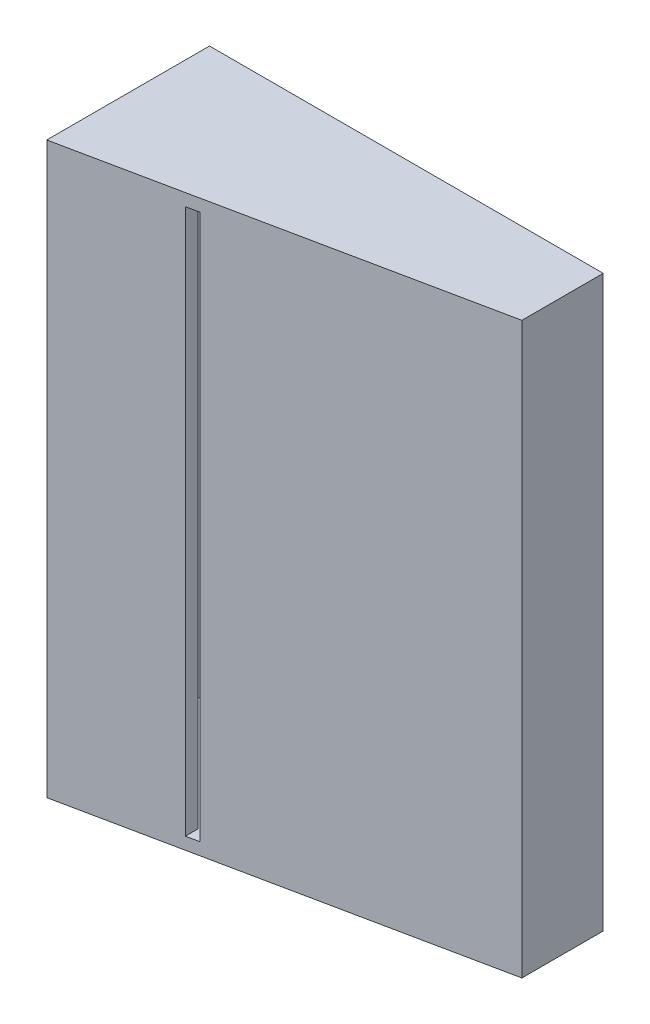
ISO-10303-21;
HEADER;
FILE_DESCRIPTION(('STEP AP214'),'2;1');
FILE_NAME('part.step','',(''),(''),'','','');
FILE_SCHEMA(('AUTOMOTIVE_DESIGN { 1 0 10303 214 1 1 1 1 }'));
ENDSEC;
DATA;
#1=APPLICATION_CONTEXT('core data for automotive mechanical design processes');
#2=APPLICATION_PROTOCOL_DEFINITION('international standard','automotive_design',2000,#1);
#3=PRODUCT_CONTEXT('',#1,'mechanical');
#4=PRODUCT('Part','Part','',(#3));
#5=PRODUCT_RELATED_PRODUCT_CATEGORY('part','',(#4));
#6=PRODUCT_DEFINITION_FORMATION('','',#4);
#7=PRODUCT_DEFINITION_CONTEXT('part definition',#1,'design');
#8=PRODUCT_DEFINITION('design','',#6,#7);
#9=PRODUCT_DEFINITION_SHAPE('','',#8);
#10=(LENGTH_UNIT() NAMED_UNIT(*) SI_UNIT(.MILLI.,.METRE.));
#11=(NAMED_UNIT(*) PLANE_ANGLE_UNIT() SI_UNIT($,.RADIAN.));
#12=(NAMED_UNIT(*) SI_UNIT($,.STERADIAN.) SOLID_ANGLE_UNIT());
#13=UNCERTAINTY_MEASURE_WITH_UNIT(LENGTH_MEASURE(1.E-05),#10,'distance_accuracy_value','');
#14=(GEOMETRIC_REPRESENTATION_CONTEXT(3) GLOBAL_UNCERTAINTY_ASSIGNED_CONTEXT((#13)) GLOBAL_UNIT_ASSIGNED_CONTEXT((#10,
#11,#12)) REPRESENTATION_CONTEXT('',''));
#15=CARTESIAN_POINT('',(0.,0.,0.));
#16=DIRECTION('',(0.,0.,1.));
#17=DIRECTION('',(1.,0.,0.));
#18=AXIS2_PLACEMENT_3D('',#15,#16,#17);
#19=CARTESIAN_POINT('',(0.,75.1134184450831,8.77829955942791));
#20=DIRECTION('',(0.202388113855779,0.,0.979305392290832));
#21=DIRECTION('',(0.979305392290832,0.,-0.202388113855779));
#22=AXIS2_PLACEMENT_3D('',#19,#20,#21);
#23=PLANE('',#22);
#24=DIRECTION('',(-0.979305392290832,0.,0.202388113855779));
#25=VECTOR('',#24,1.);
#26=CARTESIAN_POINT('',(0.,-8.25000000000003,8.77829955942791));
#27=LINE('',#26,#25);
#28=CARTESIAN_POINT('',(0.,-8.25000000000003,8.77829955942791));
#29=VERTEX_POINT('',#28);
#30=CARTESIAN_POINT('',(-31.27,-8.25000000000003,15.2407129905088));
#31=VERTEX_POINT('',#30);
#32=EDGE_CURVE('E264',#29,#31,#27,.T.);
#33=ORIENTED_EDGE('',*,*,#32,.T.);
#34=DIRECTION('',(0.,1.,0.));
#35=VECTOR('',#34,1.);
#36=CARTESIAN_POINT('',(-31.27,75.1134184450831,15.2407129905088));
#37=LINE('',#36,#35);
#38=CARTESIAN_POINT('',(-31.27,58.7499999999998,15.2407129905088));
#39=VERTEX_POINT('',#38);
#40=EDGE_CURVE('E242',#31,#39,#37,.T.);
#41=ORIENTED_EDGE('',*,*,#40,.T.);
#42=DIRECTION('',(-0.979305392290832,0.,0.202388113855779));
#43=VECTOR('',#42,1.);
#44=CARTESIAN_POINT('',(0.,58.7499999999998,8.77829955942791));
#45=LINE('',#44,#43);
#46=CARTESIAN_POINT('',(0.,58.7499999999998,8.77829955942791));
#47=VERTEX_POINT('',#46);
#48=EDGE_CURVE('E253',#47,#39,#45,.T.);
#49=ORIENTED_EDGE('',*,*,#48,.F.);
#50=DIRECTION('',(0.,-1.,0.));
#51=VECTOR('',#50,1.);
#52=CARTESIAN_POINT('',(0.,75.1134184450831,8.77829955942791));
#53=LINE('',#52,#51);
#54=EDGE_CURVE('E263',#47,#29,#53,.T.);
#55=ORIENTED_EDGE('',*,*,#54,.T.);
#56=EDGE_LOOP('',(#33,#41,#49,#55));
#57=FACE_BOUND('',#56,.T.);
#58=ADVANCED_FACE('F33',(#57),#23,.F.);
#59=CARTESIAN_POINT('',(-46.8874953737985,75.1134184450831,1.5));
#60=DIRECTION('',(0.,0.,-1.));
#61=DIRECTION('',(-1.,0.,0.));
#62=AXIS2_PLACEMENT_3D('',#59,#60,#61);
#63=PLANE('',#62);
#64=DIRECTION('',(1.,0.,0.));
#65=VECTOR('',#64,1.);
#66=CARTESIAN_POINT('',(-46.8874953737985,58.7499999999998,1.5));
#67=LINE('',#66,#65);
#68=CARTESIAN_POINT('',(-31.27,58.7499999999998,1.5));
#69=VERTEX_POINT('',#68);
#70=CARTESIAN_POINT('',(0.,58.7499999999998,1.5));
#71=VERTEX_POINT('',#70);
#72=EDGE_CURVE('E245',#69,#71,#67,.T.);
#73=ORIENTED_EDGE('',*,*,#72,.F.);
#74=DIRECTION('',(0.,-1.,0.));
#75=VECTOR('',#74,1.);
#76=CARTESIAN_POINT('',(-31.27,75.1134184450831,1.5));
#77=LINE('',#76,#75);
#78=CARTESIAN_POINT('',(-31.27,-8.25000000000002,1.5));
#79=VERTEX_POINT('',#78);
#80=EDGE_CURVE('E239',#69,#79,#77,.T.);
#81=ORIENTED_EDGE('',*,*,#80,.T.);
#82=DIRECTION('',(1.,0.,0.));
#83=VECTOR('',#82,1.);
#84=CARTESIAN_POINT('',(-46.8874953737985,-8.25000000000003,1.5));
#85=LINE('',#84,#83);
#86=CARTESIAN_POINT('',(0.,-8.25000000000003,1.5));
#87=VERTEX_POINT('',#86);
#88=EDGE_CURVE('E259',#79,#87,#85,.T.);
#89=ORIENTED_EDGE('',*,*,#88,.T.);
#90=DIRECTION('',(0.,-1.,0.));
#91=VECTOR('',#90,1.);
#92=CARTESIAN_POINT('',(0.,75.1134184450831,1.5));
#93=LINE('',#92,#91);
#94=EDGE_CURVE('E275',#71,#87,#93,.T.);
#95=ORIENTED_EDGE('',*,*,#94,.F.);
#96=EDGE_LOOP('',(#73,#81,#89,#95));
#97=FACE_BOUND('',#96,.T.);
#98=ADVANCED_FACE('F425',(#97),#63,.F.);
#99=CARTESIAN_POINT('',(-46.8874953737966,15.3499999999999,-21.511246837716));
#100=DIRECTION('',(-1.,0.,0.));
#101=DIRECTION('',(0.,0.,1.));
#102=AXIS2_PLACEMENT_3D('',#99,#100,#101);
#103=PLANE('',#102);
#104=DIRECTION('',(0.,0.,1.));
#105=VECTOR('',#104,1.);
#106=CARTESIAN_POINT('',(-46.8874953737966,35.1499999999999,-21.511246837716));
#107=LINE('',#106,#105);
#108=CARTESIAN_POINT('',(-46.8874953737966,35.1499999999999,-1.49999999999997));
#109=VERTEX_POINT('',#108);
#110=CARTESIAN_POINT('',(-46.8874953737966,35.1499999999999,0.));
#111=VERTEX_POINT('',#110);
#112=EDGE_CURVE('E37',#109,#111,#107,.T.);
#113=ORIENTED_EDGE('',*,*,#112,.F.);
#114=DIRECTION('',(0.,1.,0.));
#115=VECTOR('',#114,1.);
#116=CARTESIAN_POINT('',(-46.8874953737966,12.2499999999999,-1.49999999999997));
#117=LINE('',#116,#115);
#118=CARTESIAN_POINT('',(-46.8874953737966,38.2499999999999,-1.49999999999997));
#119=VERTEX_POINT('',#118);
#120=EDGE_CURVE('E314',#109,#119,#117,.T.);
#121=ORIENTED_EDGE('',*,*,#120,.T.);
#122=DIRECTION('',(0.,0.,1.));
#123=VECTOR('',#122,1.);
#124=CARTESIAN_POINT('',(-46.8874953737966,38.2499999999999,-2.99999999999997));
#125=LINE('',#124,#123);
#126=CARTESIAN_POINT('',(-46.8874953737966,38.2499999999999,-2.99999999999997));
#127=VERTEX_POINT('',#126);
#128=EDGE_CURVE('E342',#127,#119,#125,.T.);
#129=ORIENTED_EDGE('',*,*,#128,.F.);
#130=DIRECTION('',(0.,1.,0.));
#131=VECTOR('',#130,1.);
#132=CARTESIAN_POINT('',(-46.8874953737966,12.2499999999999,-2.99999999999997));
#133=LINE('',#132,#131);
#134=CARTESIAN_POINT('',(-46.8874953737966,12.2499999999999,-2.99999999999997));
#135=VERTEX_POINT('',#134);
#136=EDGE_CURVE('E315',#135,#127,#133,.T.);
#137=ORIENTED_EDGE('',*,*,#136,.F.);
#138=DIRECTION('',(0.,0.,1.));
#139=VECTOR('',#138,1.);
#140=CARTESIAN_POINT('',(-46.8874953737966,12.2499999999999,-2.99999999999997));
#141=LINE('',#140,#139);
#142=CARTESIAN_POINT('',(-46.8874953737966,12.2499999999999,-1.49999999999997));
#143=VERTEX_POINT('',#142);
#144=EDGE_CURVE('E325',#135,#143,#141,.T.);
#145=ORIENTED_EDGE('',*,*,#144,.T.);
#146=CARTESIAN_POINT('',(-46.8874953737966,15.3499999999999,-1.49999999999997));
#147=VERTEX_POINT('',#146);
#148=EDGE_CURVE('E326',#143,#147,#117,.T.);
#149=ORIENTED_EDGE('',*,*,#148,.T.);
#150=DIRECTION('',(0.,0.,1.));
#151=VECTOR('',#150,1.);
#152=CARTESIAN_POINT('',(-46.8874953737966,15.3499999999999,-21.511246837716));
#153=LINE('',#152,#151);
#154=CARTESIAN_POINT('',(-46.8874953737966,15.3499999999999,0.));
#155=VERTEX_POINT('',#154);
#156=EDGE_CURVE('E363',#147,#155,#153,.T.);
#157=ORIENTED_EDGE('',*,*,#156,.T.);
#158=DIRECTION('',(0.,-1.,0.));
#159=VECTOR('',#158,1.);
#160=CARTESIAN_POINT('',(-46.8874953737966,15.2499999999999,0.));
#161=LINE('',#160,#159);
#162=CARTESIAN_POINT('',(-46.8874953737985,-9.75000000000003,0.));
#163=VERTEX_POINT('',#162);
#164=EDGE_CURVE('E302',#155,#163,#161,.T.);
#165=ORIENTED_EDGE('',*,*,#164,.T.);
#166=DIRECTION('',(0.,0.,-1.));
#167=VECTOR('',#166,1.);
#168=CARTESIAN_POINT('',(-46.8874953737985,-9.75000000000003,20.));
#169=LINE('',#168,#167);
#170=CARTESIAN_POINT('',(-46.8874953737985,-9.75000000000003,20.));
#171=VERTEX_POINT('',#170);
#172=EDGE_CURVE('E311',#171,#163,#169,.T.);
#173=ORIENTED_EDGE('',*,*,#172,.F.);
#174=DIRECTION('',(0.,-1.,0.));
#175=VECTOR('',#174,1.);
#176=CARTESIAN_POINT('',(-46.8874953737966,15.2499999999999,20.));
#177=LINE('',#176,#175);
#178=CARTESIAN_POINT('',(-46.8874953737976,60.2499999999998,20.));
#179=VERTEX_POINT('',#178);
#180=EDGE_CURVE('E290',#179,#171,#177,.T.);
#181=ORIENTED_EDGE('',*,*,#180,.F.);
#182=DIRECTION('',(0.,0.,-1.));
#183=VECTOR('',#182,1.);
#184=CARTESIAN_POINT('',(-46.8874953737976,60.2499999999998,20.));
#185=LINE('',#184,#183);
#186=CARTESIAN_POINT('',(-46.8874953737976,60.2499999999998,0.));
#187=VERTEX_POINT('',#186);
#188=EDGE_CURVE('E292',#179,#187,#185,.T.);
#189=ORIENTED_EDGE('',*,*,#188,.T.);
#190=EDGE_CURVE('E293',#187,#111,#161,.T.);
#191=ORIENTED_EDGE('',*,*,#190,.T.);
#192=EDGE_LOOP('',(#113,#121,#129,#137,#145,#149,#157,#165,#173,#181,#189,#191));
#193=FACE_BOUND('',#192,.T.);
#194=DIRECTION('',(0.,0.,-1.));
#195=VECTOR('',#194,1.);
#196=CARTESIAN_POINT('',(-46.8874953737985,58.7499999999998,18.4683021131017));
#197=LINE('',#196,#195);
#198=CARTESIAN_POINT('',(-46.8874953737985,58.7499999999998,18.4683021131017));
#199=VERTEX_POINT('',#198);
#200=CARTESIAN_POINT('',(-46.8874953737985,58.7499999999998,1.5));
#201=VERTEX_POINT('',#200);
#202=EDGE_CURVE('E249',#199,#201,#197,.T.);
#203=ORIENTED_EDGE('',*,*,#202,.F.);
#204=DIRECTION('',(0.,-1.,0.));
#205=VECTOR('',#204,1.);
#206=CARTESIAN_POINT('',(-46.8874953737985,75.1134184450831,18.4683021131017));
#207=LINE('',#206,#205);
#208=CARTESIAN_POINT('',(-46.8874953737985,-8.25000000000003,18.4683021131017));
#209=VERTEX_POINT('',#208);
#210=EDGE_CURVE('E276',#199,#209,#207,.T.);
#211=ORIENTED_EDGE('',*,*,#210,.T.);
#212=DIRECTION('',(0.,0.,-1.));
#213=VECTOR('',#212,1.);
#214=CARTESIAN_POINT('',(-46.8874953737985,-8.25000000000003,18.4683021131017));
#215=LINE('',#214,#213);
#216=CARTESIAN_POINT('',(-46.8874953737985,-8.25000000000003,1.5));
#217=VERTEX_POINT('',#216);
#218=EDGE_CURVE('E260',#209,#217,#215,.T.);
#219=ORIENTED_EDGE('',*,*,#218,.T.);
#220=DIRECTION('',(0.,-1.,0.));
#221=VECTOR('',#220,1.);
#222=CARTESIAN_POINT('',(-46.8874953737985,75.1134184450831,1.5));
#223=LINE('',#222,#221);
#224=EDGE_CURVE('E273',#201,#217,#223,.T.);
#225=ORIENTED_EDGE('',*,*,#224,.F.);
#226=EDGE_LOOP('',(#203,#211,#219,#225));
#227=FACE_BOUND('',#226,.T.);
#228=ADVANCED_FACE('F372',(#193,#227),#103,.T.);
#229=CARTESIAN_POINT('',(-46.8874953737966,35.1499999999999,-21.511246837716));
#230=DIRECTION('',(0.,1.,0.));
#231=DIRECTION('',(0.,0.,1.));
#232=AXIS2_PLACEMENT_3D('',#229,#230,#231);
#233=PLANE('',#232);
#234=DIRECTION('',(1.,0.,0.));
#235=VECTOR('',#234,1.);
#236=CARTESIAN_POINT('',(-46.8874953737966,35.1499999999999,-1.49999999999997));
#237=LINE('',#236,#235);
#238=CARTESIAN_POINT('',(-43.9874953737966,35.1499999999999,-1.49999999999997));
#239=VERTEX_POINT('',#238);
#240=EDGE_CURVE('E11',#109,#239,#237,.T.);
#241=ORIENTED_EDGE('',*,*,#240,.F.);
#242=ORIENTED_EDGE('',*,*,#112,.T.);
#243=DIRECTION('',(-1.,0.,0.));
#244=VECTOR('',#243,1.);
#245=CARTESIAN_POINT('',(-46.8874953737966,35.1499999999999,0.));
#246=LINE('',#245,#244);
#247=CARTESIAN_POINT('',(-43.9874953737966,35.1499999999999,0.));
#248=VERTEX_POINT('',#247);
#249=EDGE_CURVE('E345',#248,#111,#246,.T.);
#250=ORIENTED_EDGE('',*,*,#249,.F.);
#251=DIRECTION('',(0.,0.,1.));
#252=VECTOR('',#251,1.);
#253=CARTESIAN_POINT('',(-43.9874953737966,35.1499999999999,-21.511246837716));
#254=LINE('',#253,#252);
#255=EDGE_CURVE('E349',#239,#248,#254,.T.);
#256=ORIENTED_EDGE('',*,*,#255,.F.);
#257=EDGE_LOOP('',(#241,#242,#250,#256));
#258=FACE_BOUND('',#257,.T.);
#259=ADVANCED_FACE('F35',(#258),#233,.T.);
#260=CARTESIAN_POINT('',(-43.9874953737966,35.1499999999999,-21.511246837716));
#261=DIRECTION('',(1.,0.,0.));
#262=DIRECTION('',(0.,1.,0.));
#263=AXIS2_PLACEMENT_3D('',#260,#261,#262);
#264=PLANE('',#263);
#265=DIRECTION('',(0.,-1.,0.));
#266=VECTOR('',#265,1.);
#267=CARTESIAN_POINT('',(-43.9874953737966,35.1499999999999,-1.49999999999997));
#268=LINE('',#267,#266);
#269=CARTESIAN_POINT('',(-43.9874953737966,15.3499999999999,-1.49999999999997));
#270=VERTEX_POINT('',#269);
#271=EDGE_CURVE('E42',#239,#270,#268,.T.);
#272=ORIENTED_EDGE('',*,*,#271,.F.);
#273=ORIENTED_EDGE('',*,*,#255,.T.);
#274=DIRECTION('',(0.,1.,0.));
#275=VECTOR('',#274,1.);
#276=CARTESIAN_POINT('',(-43.9874953737966,35.1499999999999,0.));
#277=LINE('',#276,#275);
#278=CARTESIAN_POINT('',(-43.9874953737966,15.3499999999999,0.));
#279=VERTEX_POINT('',#278);
#280=EDGE_CURVE('E357',#279,#248,#277,.T.);
#281=ORIENTED_EDGE('',*,*,#280,.F.);
#282=DIRECTION('',(0.,0.,1.));
#283=VECTOR('',#282,1.);
#284=CARTESIAN_POINT('',(-43.9874953737966,15.3499999999999,-21.511246837716));
#285=LINE('',#284,#283);
#286=EDGE_CURVE('E362',#270,#279,#285,.T.);
#287=ORIENTED_EDGE('',*,*,#286,.F.);
#288=EDGE_LOOP('',(#272,#273,#281,#287));
#289=FACE_BOUND('',#288,.T.);
#290=ADVANCED_FACE('F394',(#289),#264,.T.);
#291=CARTESIAN_POINT('',(-43.9874953737966,15.3499999999999,-21.511246837716));
#292=DIRECTION('',(0.,-1.,0.));
#293=DIRECTION('',(1.,0.,0.));
#294=AXIS2_PLACEMENT_3D('',#291,#292,#293);
#295=PLANE('',#294);
#296=DIRECTION('',(-1.,0.,0.));
#297=VECTOR('',#296,1.);
#298=CARTESIAN_POINT('',(-43.9874953737966,15.3499999999999,-1.49999999999997));
#299=LINE('',#298,#297);
#300=EDGE_CURVE('E346',#270,#147,#299,.T.);
#301=ORIENTED_EDGE('',*,*,#300,.F.);
#302=ORIENTED_EDGE('',*,*,#286,.T.);
#303=DIRECTION('',(1.,0.,0.));
#304=VECTOR('',#303,1.);
#305=CARTESIAN_POINT('',(-43.9874953737966,15.3499999999999,0.));
#306=LINE('',#305,#304);
#307=EDGE_CURVE('E354',#155,#279,#306,.T.);
#308=ORIENTED_EDGE('',*,*,#307,.F.);
#309=ORIENTED_EDGE('',*,*,#156,.F.);
#310=EDGE_LOOP('',(#301,#302,#308,#309));
#311=FACE_BOUND('',#310,.T.);
#312=ADVANCED_FACE('F391',(#311),#295,.T.);
#313=CARTESIAN_POINT('',(-24.387495373798,38.2499999999999,-2.99999999999997));
#314=DIRECTION('',(0.,-1.,0.));
#315=DIRECTION('',(1.,0.,0.));
#316=AXIS2_PLACEMENT_3D('',#313,#314,#315);
#317=PLANE('',#316);
#318=DIRECTION('',(1.,0.,0.));
#319=VECTOR('',#318,1.);
#320=CARTESIAN_POINT('',(-24.387495373798,38.2499999999999,-1.49999999999997));
#321=LINE('',#320,#319);
#322=CARTESIAN_POINT('',(-24.387495373798,38.2499999999999,-1.49999999999997));
#323=VERTEX_POINT('',#322);
#324=EDGE_CURVE('E329',#119,#323,#321,.T.);
#325=ORIENTED_EDGE('',*,*,#324,.T.);
#326=DIRECTION('',(0.,0.,1.));
#327=VECTOR('',#326,1.);
#328=CARTESIAN_POINT('',(-24.387495373798,38.2499999999999,-2.99999999999997));
#329=LINE('',#328,#327);
#330=CARTESIAN_POINT('',(-24.387495373798,38.2499999999999,-2.99999999999997));
#331=VERTEX_POINT('',#330);
#332=EDGE_CURVE('E339',#331,#323,#329,.T.);
#333=ORIENTED_EDGE('',*,*,#332,.F.);
#334=DIRECTION('',(1.,0.,0.));
#335=VECTOR('',#334,1.);
#336=CARTESIAN_POINT('',(-24.387495373798,38.2499999999999,-2.99999999999997));
#337=LINE('',#336,#335);
#338=EDGE_CURVE('E318',#127,#331,#337,.T.);
#339=ORIENTED_EDGE('',*,*,#338,.F.);
#340=ORIENTED_EDGE('',*,*,#128,.T.);
#341=EDGE_LOOP('',(#325,#333,#339,#340));
#342=FACE_BOUND('',#341,.T.);
#343=ADVANCED_FACE('F402',(#342),#317,.F.);
#344=CARTESIAN_POINT('',(-24.387495373798,12.2499999999999,-2.99999999999997));
#345=DIRECTION('',(-1.,0.,0.));
#346=DIRECTION('',(0.,0.,1.));
#347=AXIS2_PLACEMENT_3D('',#344,#345,#346);
#348=PLANE('',#347);
#349=DIRECTION('',(0.,-1.,0.));
#350=VECTOR('',#349,1.);
#351=CARTESIAN_POINT('',(-24.387495373798,12.2499999999999,-1.49999999999997));
#352=LINE('',#351,#350);
#353=CARTESIAN_POINT('',(-24.387495373798,12.2499999999999,-1.49999999999997));
#354=VERTEX_POINT('',#353);
#355=EDGE_CURVE('E331',#323,#354,#352,.T.);
#356=ORIENTED_EDGE('',*,*,#355,.T.);
#357=DIRECTION('',(0.,0.,1.));
#358=VECTOR('',#357,1.);
#359=CARTESIAN_POINT('',(-24.387495373798,12.2499999999999,-2.99999999999997));
#360=LINE('',#359,#358);
#361=CARTESIAN_POINT('',(-24.387495373798,12.2499999999999,-2.99999999999997));
#362=VERTEX_POINT('',#361);
#363=EDGE_CURVE('E336',#362,#354,#360,.T.);
#364=ORIENTED_EDGE('',*,*,#363,.F.);
#365=DIRECTION('',(0.,-1.,0.));
#366=VECTOR('',#365,1.);
#367=CARTESIAN_POINT('',(-24.387495373798,12.2499999999999,-2.99999999999997));
#368=LINE('',#367,#366);
#369=EDGE_CURVE('E321',#331,#362,#368,.T.);
#370=ORIENTED_EDGE('',*,*,#369,.F.);
#371=ORIENTED_EDGE('',*,*,#332,.T.);
#372=EDGE_LOOP('',(#356,#364,#370,#371));
#373=FACE_BOUND('',#372,.T.);
#374=ADVANCED_FACE('F415',(#373),#348,.F.);
#375=CARTESIAN_POINT('',(-24.387495373798,12.2499999999999,-2.99999999999997));
#376=DIRECTION('',(0.,1.,0.));
#377=DIRECTION('',(-1.,0.,0.));
#378=AXIS2_PLACEMENT_3D('',#375,#376,#377);
#379=PLANE('',#378);
#380=DIRECTION('',(-1.,0.,0.));
#381=VECTOR('',#380,1.);
#382=CARTESIAN_POINT('',(-24.387495373798,12.2499999999999,-1.49999999999997));
#383=LINE('',#382,#381);
#384=EDGE_CURVE('E319',#354,#143,#383,.T.);
#385=ORIENTED_EDGE('',*,*,#384,.T.);
#386=ORIENTED_EDGE('',*,*,#144,.F.);
#387=DIRECTION('',(-1.,0.,0.));
#388=VECTOR('',#387,1.);
#389=CARTESIAN_POINT('',(-24.387495373798,12.2499999999999,-2.99999999999997));
#390=LINE('',#389,#388);
#391=EDGE_CURVE('E323',#362,#135,#390,.T.);
#392=ORIENTED_EDGE('',*,*,#391,.F.);
#393=ORIENTED_EDGE('',*,*,#363,.T.);
#394=EDGE_LOOP('',(#385,#386,#392,#393));
#395=FACE_BOUND('',#394,.T.);
#396=ADVANCED_FACE('F411',(#395),#379,.F.);
#397=CARTESIAN_POINT('',(0.,0.,-2.99999999999997));
#398=DIRECTION('',(0.,0.,1.));
#399=DIRECTION('',(1.,0.,0.));
#400=AXIS2_PLACEMENT_3D('',#397,#398,#399);
#401=PLANE('',#400);
#402=ORIENTED_EDGE('',*,*,#136,.T.);
#403=ORIENTED_EDGE('',*,*,#338,.T.);
#404=ORIENTED_EDGE('',*,*,#369,.T.);
#405=ORIENTED_EDGE('',*,*,#391,.T.);
#406=EDGE_LOOP('',(#402,#403,#404,#405));
#407=FACE_BOUND('',#406,.T.);
#408=ADVANCED_FACE('F406',(#407),#401,.F.);
#409=CARTESIAN_POINT('',(0.,0.,-1.49999999999997));
#410=DIRECTION('',(0.,0.,1.));
#411=DIRECTION('',(1.,0.,0.));
#412=AXIS2_PLACEMENT_3D('',#409,#410,#411);
#413=PLANE('',#412);
#414=ORIENTED_EDGE('',*,*,#120,.F.);
#415=ORIENTED_EDGE('',*,*,#240,.T.);
#416=ORIENTED_EDGE('',*,*,#271,.T.);
#417=ORIENTED_EDGE('',*,*,#300,.T.);
#418=ORIENTED_EDGE('',*,*,#148,.F.);
#419=ORIENTED_EDGE('',*,*,#384,.F.);
#420=ORIENTED_EDGE('',*,*,#355,.F.);
#421=ORIENTED_EDGE('',*,*,#324,.F.);
#422=EDGE_LOOP('',(#414,#415,#416,#417,#418,#419,#420,#421));
#423=FACE_BOUND('',#422,.T.);
#424=ADVANCED_FACE('F396',(#423),#413,.T.);
#425=CARTESIAN_POINT('',(0.,0.,0.));
#426=DIRECTION('',(0.,0.,1.));
#427=DIRECTION('',(1.,0.,0.));
#428=AXIS2_PLACEMENT_3D('',#425,#426,#427);
#429=PLANE('',#428);
#430=DIRECTION('',(-1.,0.,0.));
#431=VECTOR('',#430,1.);
#432=CARTESIAN_POINT('',(-32.77,-8.25000000000002,0.));
#433=LINE('',#432,#431);
#434=CARTESIAN_POINT('',(-31.27,-8.25000000000002,0.));
#435=VERTEX_POINT('',#434);
#436=CARTESIAN_POINT('',(-32.77,-8.25000000000002,0.));
#437=VERTEX_POINT('',#436);
#438=EDGE_CURVE('E209',#435,#437,#433,.T.);
#439=ORIENTED_EDGE('',*,*,#438,.F.);
#440=DIRECTION('',(0.,-1.,0.));
#441=VECTOR('',#440,1.);
#442=CARTESIAN_POINT('',(-31.27,58.7499999999998,0.));
#443=LINE('',#442,#441);
#444=CARTESIAN_POINT('',(-31.27,58.7499999999998,0.));
#445=VERTEX_POINT('',#444);
#446=EDGE_CURVE('E50',#445,#435,#443,.T.);
#447=ORIENTED_EDGE('',*,*,#446,.F.);
#448=DIRECTION('',(1.,0.,0.));
#449=VECTOR('',#448,1.);
#450=CARTESIAN_POINT('',(-32.77,58.7499999999998,0.));
#451=LINE('',#450,#449);
#452=CARTESIAN_POINT('',(-32.77,58.7499999999998,0.));
#453=VERTEX_POINT('',#452);
#454=EDGE_CURVE('E218',#453,#445,#451,.T.);
#455=ORIENTED_EDGE('',*,*,#454,.F.);
#456=DIRECTION('',(0.,1.,0.));
#457=VECTOR('',#456,1.);
#458=CARTESIAN_POINT('',(-32.77,58.7499999999998,0.));
#459=LINE('',#458,#457);
#460=EDGE_CURVE('E200',#437,#453,#459,.T.);
#461=ORIENTED_EDGE('',*,*,#460,.F.);
#462=EDGE_LOOP('',(#439,#447,#455,#461));
#463=FACE_BOUND('',#462,.T.);
#464=ORIENTED_EDGE('',*,*,#280,.T.);
#465=ORIENTED_EDGE('',*,*,#249,.T.);
#466=ORIENTED_EDGE('',*,*,#190,.F.);
#467=DIRECTION('',(-1.,0.,0.));
#468=VECTOR('',#467,1.);
#469=CARTESIAN_POINT('',(1.5,60.2499999999998,0.));
#470=LINE('',#469,#468);
#471=CARTESIAN_POINT('',(1.5,60.2499999999998,0.));
#472=VERTEX_POINT('',#471);
#473=EDGE_CURVE('E299',#472,#187,#470,.T.);
#474=ORIENTED_EDGE('',*,*,#473,.F.);
#475=DIRECTION('',(0.,1.,0.));
#476=VECTOR('',#475,1.);
#477=CARTESIAN_POINT('',(1.5,-9.75000000000003,0.));
#478=LINE('',#477,#476);
#479=CARTESIAN_POINT('',(1.5,-9.75000000000003,0.));
#480=VERTEX_POINT('',#479);
#481=EDGE_CURVE('E296',#480,#472,#478,.T.);
#482=ORIENTED_EDGE('',*,*,#481,.F.);
#483=DIRECTION('',(1.,0.,0.));
#484=VECTOR('',#483,1.);
#485=CARTESIAN_POINT('',(-46.8874953737985,-9.75000000000003,0.));
#486=LINE('',#485,#484);
#487=EDGE_CURVE('E289',#163,#480,#486,.T.);
#488=ORIENTED_EDGE('',*,*,#487,.F.);
#489=ORIENTED_EDGE('',*,*,#164,.F.);
#490=ORIENTED_EDGE('',*,*,#307,.T.);
#491=EDGE_LOOP('',(#464,#465,#466,#474,#482,#488,#489,#490));
#492=FACE_BOUND('',#491,.T.);
#493=ADVANCED_FACE('F215',(#463,#492),#429,.F.);
#494=CARTESIAN_POINT('',(-46.8874953737985,-9.75000000000003,20.));
#495=DIRECTION('',(0.,1.,0.));
#496=DIRECTION('',(0.,0.,1.));
#497=AXIS2_PLACEMENT_3D('',#494,#495,#496);
#498=PLANE('',#497);
#499=DIRECTION('',(0.,0.,-1.));
#500=VECTOR('',#499,1.);
#501=CARTESIAN_POINT('',(1.5,-9.75000000000003,20.));
#502=LINE('',#501,#500);
#503=CARTESIAN_POINT('',(1.5,-9.75000000000003,10.));
#504=VERTEX_POINT('',#503);
#505=EDGE_CURVE('E309',#504,#480,#502,.T.);
#506=ORIENTED_EDGE('',*,*,#505,.F.);
#507=DIRECTION('',(0.979305392290832,0.,-0.202388113855779));
#508=VECTOR('',#507,1.);
#509=CARTESIAN_POINT('',(-46.8874953737985,-9.75000000000003,20.));
#510=LINE('',#509,#508);
#511=EDGE_CURVE('E282',#171,#504,#510,.T.);
#512=ORIENTED_EDGE('',*,*,#511,.F.);
#513=ORIENTED_EDGE('',*,*,#172,.T.);
#514=ORIENTED_EDGE('',*,*,#487,.T.);
#515=EDGE_LOOP('',(#506,#512,#513,#514));
#516=FACE_BOUND('',#515,.T.);
#517=ADVANCED_FACE('F389',(#516),#498,.F.);
#518=CARTESIAN_POINT('',(1.5,-9.75000000000003,20.));
#519=DIRECTION('',(-1.,0.,0.));
#520=DIRECTION('',(0.,0.,1.));
#521=AXIS2_PLACEMENT_3D('',#518,#519,#520);
#522=PLANE('',#521);
#523=DIRECTION('',(0.,0.,-1.));
#524=VECTOR('',#523,1.);
#525=CARTESIAN_POINT('',(1.5,60.2499999999998,20.));
#526=LINE('',#525,#524);
#527=CARTESIAN_POINT('',(1.5,60.2499999999998,10.));
#528=VERTEX_POINT('',#527);
#529=EDGE_CURVE('E307',#528,#472,#526,.T.);
#530=ORIENTED_EDGE('',*,*,#529,.F.);
#531=DIRECTION('',(0.,-1.,0.));
#532=VECTOR('',#531,1.);
#533=CARTESIAN_POINT('',(1.5,109.660016277566,10.));
#534=LINE('',#533,#532);
#535=EDGE_CURVE('E284',#528,#504,#534,.T.);
#536=ORIENTED_EDGE('',*,*,#535,.T.);
#537=ORIENTED_EDGE('',*,*,#505,.T.);
#538=ORIENTED_EDGE('',*,*,#481,.T.);
#539=EDGE_LOOP('',(#530,#536,#537,#538));
#540=FACE_BOUND('',#539,.T.);
#541=ADVANCED_FACE('F385',(#540),#522,.F.);
#542=CARTESIAN_POINT('',(1.5,60.2499999999998,20.));
#543=DIRECTION('',(0.,-1.,0.));
#544=DIRECTION('',(0.,0.,-1.));
#545=AXIS2_PLACEMENT_3D('',#542,#543,#544);
#546=PLANE('',#545);
#547=ORIENTED_EDGE('',*,*,#188,.F.);
#548=DIRECTION('',(-0.979305392290832,0.,0.202388113855779));
#549=VECTOR('',#548,1.);
#550=CARTESIAN_POINT('',(-46.8874953737985,60.2499999999998,20.));
#551=LINE('',#550,#549);
#552=EDGE_CURVE('E287',#528,#179,#551,.T.);
#553=ORIENTED_EDGE('',*,*,#552,.F.);
#554=ORIENTED_EDGE('',*,*,#529,.T.);
#555=ORIENTED_EDGE('',*,*,#473,.T.);
#556=EDGE_LOOP('',(#547,#553,#554,#555));
#557=FACE_BOUND('',#556,.T.);
#558=ADVANCED_FACE('F379',(#557),#546,.F.);
#559=CARTESIAN_POINT('',(-46.8874953737985,109.660016277566,20.));
#560=DIRECTION('',(-0.202388113855779,0.,-0.979305392290832));
#561=DIRECTION('',(-0.979305392290832,0.,0.202388113855779));
#562=AXIS2_PLACEMENT_3D('',#559,#560,#561);
#563=PLANE('',#562);
#564=DIRECTION('',(-0.979305392290832,0.,0.202388113855779));
#565=VECTOR('',#564,1.);
#566=CARTESIAN_POINT('',(-46.162336162293,58.7499999999998,19.8501349975022));
#567=LINE('',#566,#565);
#568=CARTESIAN_POINT('',(-31.27,58.7499999999998,16.7724108774071));
#569=VERTEX_POINT('',#568);
#570=CARTESIAN_POINT('',(-32.77,58.7499999999998,17.0824083237334));
#571=VERTEX_POINT('',#570);
#572=EDGE_CURVE('E454',#569,#571,#567,.T.);
#573=ORIENTED_EDGE('',*,*,#572,.F.);
#574=DIRECTION('',(0.,1.,0.));
#575=VECTOR('',#574,1.);
#576=CARTESIAN_POINT('',(-31.27,58.7499999999998,16.7724108774071));
#577=LINE('',#576,#575);
#578=CARTESIAN_POINT('',(-31.27,-8.25000000000002,16.7724108774071));
#579=VERTEX_POINT('',#578);
#580=EDGE_CURVE('E234',#579,#569,#577,.T.);
#581=ORIENTED_EDGE('',*,*,#580,.F.);
#582=DIRECTION('',(0.979305392290832,0.,-0.202388113855779));
#583=VECTOR('',#582,1.);
#584=CARTESIAN_POINT('',(-46.162336162293,-8.25000000000002,19.8501349975022));
#585=LINE('',#584,#583);
#586=CARTESIAN_POINT('',(-32.77,-8.25000000000002,17.0824083237334));
#587=VERTEX_POINT('',#586);
#588=EDGE_CURVE('E232',#587,#579,#585,.T.);
#589=ORIENTED_EDGE('',*,*,#588,.F.);
#590=DIRECTION('',(0.,-1.,0.));
#591=VECTOR('',#590,1.);
#592=CARTESIAN_POINT('',(-32.77,58.7499999999998,17.0824083237334));
#593=LINE('',#592,#591);
#594=EDGE_CURVE('E225',#571,#587,#593,.T.);
#595=ORIENTED_EDGE('',*,*,#594,.F.);
#596=EDGE_LOOP('',(#573,#581,#589,#595));
#597=FACE_BOUND('',#596,.T.);
#598=ORIENTED_EDGE('',*,*,#552,.T.);
#599=ORIENTED_EDGE('',*,*,#180,.T.);
#600=ORIENTED_EDGE('',*,*,#511,.T.);
#601=ORIENTED_EDGE('',*,*,#535,.F.);
#602=EDGE_LOOP('',(#598,#599,#600,#601));
#603=FACE_BOUND('',#602,.T.);
#604=ADVANCED_FACE('F460',(#597,#603),#563,.F.);
#605=CARTESIAN_POINT('',(0.,-8.25000000000003,0.));
#606=DIRECTION('',(0.,-1.,0.));
#607=DIRECTION('',(0.,0.,-1.));
#608=AXIS2_PLACEMENT_3D('',#605,#606,#607);
#609=PLANE('',#608);
#610=CARTESIAN_POINT('',(-32.77,-8.25000000000002,15.550710436835));
#611=VERTEX_POINT('',#610);
#612=EDGE_CURVE('E267',#611,#209,#27,.T.);
#613=ORIENTED_EDGE('',*,*,#612,.F.);
#614=DIRECTION('',(0.,0.,-1.));
#615=VECTOR('',#614,1.);
#616=CARTESIAN_POINT('',(-32.77,-8.25000000000002,84.6522954072327));
#617=LINE('',#616,#615);
#618=EDGE_CURVE('E58',#587,#611,#617,.T.);
#619=ORIENTED_EDGE('',*,*,#618,.F.);
#620=ORIENTED_EDGE('',*,*,#588,.T.);
#621=DIRECTION('',(0.,0.,-1.));
#622=VECTOR('',#621,1.);
#623=CARTESIAN_POINT('',(-31.27,-8.25000000000002,84.6522954072327));
#624=LINE('',#623,#622);
#625=EDGE_CURVE('E206',#579,#31,#624,.T.);
#626=ORIENTED_EDGE('',*,*,#625,.T.);
#627=ORIENTED_EDGE('',*,*,#32,.F.);
#628=DIRECTION('',(0.,0.,1.));
#629=VECTOR('',#628,1.);
#630=CARTESIAN_POINT('',(0.,-8.25000000000003,1.5));
#631=LINE('',#630,#629);
#632=EDGE_CURVE('E268',#87,#29,#631,.T.);
#633=ORIENTED_EDGE('',*,*,#632,.F.);
#634=ORIENTED_EDGE('',*,*,#88,.F.);
#635=EDGE_CURVE('E212',#79,#435,#624,.T.);
#636=ORIENTED_EDGE('',*,*,#635,.T.);
#637=ORIENTED_EDGE('',*,*,#438,.T.);
#638=CARTESIAN_POINT('',(-32.77,-8.25000000000003,1.5));
#639=VERTEX_POINT('',#638);
#640=EDGE_CURVE('E196',#639,#437,#617,.T.);
#641=ORIENTED_EDGE('',*,*,#640,.F.);
#642=EDGE_CURVE('E271',#217,#639,#85,.T.);
#643=ORIENTED_EDGE('',*,*,#642,.F.);
#644=ORIENTED_EDGE('',*,*,#218,.F.);
#645=EDGE_LOOP('',(#613,#619,#620,#626,#627,#633,#634,#636,#637,#641,#643,#644));
#646=FACE_BOUND('',#645,.T.);
#647=ADVANCED_FACE('F210',(#646),#609,.F.);
#648=CARTESIAN_POINT('',(0.,75.1134184450831,1.5));
#649=DIRECTION('',(1.,0.,0.));
#650=DIRECTION('',(0.,0.,-1.));
#651=AXIS2_PLACEMENT_3D('',#648,#649,#650);
#652=PLANE('',#651);
#653=ORIENTED_EDGE('',*,*,#94,.T.);
#654=ORIENTED_EDGE('',*,*,#632,.T.);
#655=ORIENTED_EDGE('',*,*,#54,.F.);
#656=DIRECTION('',(0.,0.,1.));
#657=VECTOR('',#656,1.);
#658=CARTESIAN_POINT('',(0.,58.7499999999998,1.5));
#659=LINE('',#658,#657);
#660=EDGE_CURVE('E256',#71,#47,#659,.T.);
#661=ORIENTED_EDGE('',*,*,#660,.F.);
#662=EDGE_LOOP('',(#653,#654,#655,#661));
#663=FACE_BOUND('',#662,.T.);
#664=ADVANCED_FACE('F437',(#663),#652,.F.);
#665=CARTESIAN_POINT('',(-32.77,58.7499999999998,15.550710436835));
#666=VERTEX_POINT('',#665);
#667=EDGE_CURVE('E252',#666,#199,#45,.T.);
#668=ORIENTED_EDGE('',*,*,#667,.F.);
#669=DIRECTION('',(0.,-1.,0.));
#670=VECTOR('',#669,1.);
#671=CARTESIAN_POINT('',(-32.77,75.1134184450831,15.550710436835));
#672=LINE('',#671,#670);
#673=EDGE_CURVE('E236',#666,#611,#672,.T.);
#674=ORIENTED_EDGE('',*,*,#673,.T.);
#675=ORIENTED_EDGE('',*,*,#612,.T.);
#676=ORIENTED_EDGE('',*,*,#210,.F.);
#677=EDGE_LOOP('',(#668,#674,#675,#676));
#678=FACE_BOUND('',#677,.T.);
#679=ADVANCED_FACE('F428',(#678),#23,.F.);
#680=ORIENTED_EDGE('',*,*,#642,.T.);
#681=DIRECTION('',(0.,1.,0.));
#682=VECTOR('',#681,1.);
#683=CARTESIAN_POINT('',(-32.77,75.1134184450831,1.5));
#684=LINE('',#683,#682);
#685=CARTESIAN_POINT('',(-32.77,58.7499999999998,1.5));
#686=VERTEX_POINT('',#685);
#687=EDGE_CURVE('E203',#639,#686,#684,.T.);
#688=ORIENTED_EDGE('',*,*,#687,.T.);
#689=EDGE_CURVE('E246',#201,#686,#67,.T.);
#690=ORIENTED_EDGE('',*,*,#689,.F.);
#691=ORIENTED_EDGE('',*,*,#224,.T.);
#692=EDGE_LOOP('',(#680,#688,#690,#691));
#693=FACE_BOUND('',#692,.T.);
#694=ADVANCED_FACE('F434',(#693),#63,.F.);
#695=CARTESIAN_POINT('',(0.,58.7499999999998,0.));
#696=DIRECTION('',(0.,1.,0.));
#697=DIRECTION('',(0.,0.,-1.));
#698=AXIS2_PLACEMENT_3D('',#695,#696,#697);
#699=PLANE('',#698);
#700=ORIENTED_EDGE('',*,*,#689,.T.);
#701=DIRECTION('',(0.,0.,-1.));
#702=VECTOR('',#701,1.);
#703=CARTESIAN_POINT('',(-32.77,58.7499999999998,84.6522954072327));
#704=LINE('',#703,#702);
#705=EDGE_CURVE('E229',#686,#453,#704,.T.);
#706=ORIENTED_EDGE('',*,*,#705,.T.);
#707=ORIENTED_EDGE('',*,*,#454,.T.);
#708=DIRECTION('',(0.,0.,-1.));
#709=VECTOR('',#708,1.);
#710=CARTESIAN_POINT('',(-31.27,58.7499999999998,84.6522954072327));
#711=LINE('',#710,#709);
#712=EDGE_CURVE('E226',#69,#445,#711,.T.);
#713=ORIENTED_EDGE('',*,*,#712,.F.);
#714=ORIENTED_EDGE('',*,*,#72,.T.);
#715=ORIENTED_EDGE('',*,*,#660,.T.);
#716=ORIENTED_EDGE('',*,*,#48,.T.);
#717=EDGE_CURVE('E223',#569,#39,#711,.T.);
#718=ORIENTED_EDGE('',*,*,#717,.F.);
#719=ORIENTED_EDGE('',*,*,#572,.T.);
#720=EDGE_CURVE('E227',#571,#666,#704,.T.);
#721=ORIENTED_EDGE('',*,*,#720,.T.);
#722=ORIENTED_EDGE('',*,*,#667,.T.);
#723=ORIENTED_EDGE('',*,*,#202,.T.);
#724=EDGE_LOOP('',(#700,#706,#707,#713,#714,#715,#716,#718,#719,#721,#722,#723));
#725=FACE_BOUND('',#724,.T.);
#726=ADVANCED_FACE('F443',(#725),#699,.F.);
#727=CARTESIAN_POINT('',(-32.77,58.7499999999998,84.6522954072327));
#728=DIRECTION('',(-1.,0.,0.));
#729=DIRECTION('',(0.,0.,1.));
#730=AXIS2_PLACEMENT_3D('',#727,#728,#729);
#731=PLANE('',#730);
#732=ORIENTED_EDGE('',*,*,#640,.T.);
#733=ORIENTED_EDGE('',*,*,#460,.T.);
#734=ORIENTED_EDGE('',*,*,#705,.F.);
#735=ORIENTED_EDGE('',*,*,#687,.F.);
#736=EDGE_LOOP('',(#732,#733,#734,#735));
#737=FACE_BOUND('',#736,.T.);
#738=ADVANCED_FACE('F198',(#737),#731,.F.);
#739=CARTESIAN_POINT('',(-31.27,58.7499999999998,84.6522954072327));
#740=DIRECTION('',(1.,0.,0.));
#741=DIRECTION('',(0.,0.,-1.));
#742=AXIS2_PLACEMENT_3D('',#739,#740,#741);
#743=PLANE('',#742);
#744=ORIENTED_EDGE('',*,*,#712,.T.);
#745=ORIENTED_EDGE('',*,*,#446,.T.);
#746=ORIENTED_EDGE('',*,*,#635,.F.);
#747=ORIENTED_EDGE('',*,*,#80,.F.);
#748=EDGE_LOOP('',(#744,#745,#746,#747));
#749=FACE_BOUND('',#748,.T.);
#750=ADVANCED_FACE('F477',(#749),#743,.F.);
#751=ORIENTED_EDGE('',*,*,#625,.F.);
#752=ORIENTED_EDGE('',*,*,#580,.T.);
#753=ORIENTED_EDGE('',*,*,#717,.T.);
#754=ORIENTED_EDGE('',*,*,#40,.F.);
#755=EDGE_LOOP('',(#751,#752,#753,#754));
#756=FACE_BOUND('',#755,.T.);
#757=ADVANCED_FACE('F468',(#756),#743,.F.);
#758=ORIENTED_EDGE('',*,*,#720,.F.);
#759=ORIENTED_EDGE('',*,*,#594,.T.);
#760=ORIENTED_EDGE('',*,*,#618,.T.);
#761=ORIENTED_EDGE('',*,*,#673,.F.);
#762=EDGE_LOOP('',(#758,#759,#760,#761));
#763=FACE_BOUND('',#762,.T.);
#764=ADVANCED_FACE('F457',(#763),#731,.F.);
#765=CLOSED_SHELL('',(#58,#98,#228,#259,#290,#312,#343,#374,#396,#408,#424,#493,#517,#541,#558,
#604,#647,#664,#679,#694,#726,#738,#750,#757,#764));
#766=MANIFOLD_SOLID_BREP('B2',#765);
#767=ADVANCED_BREP_SHAPE_REPRESENTATION('',(#18,#766),#14);
#768=SHAPE_DEFINITION_REPRESENTATION(#9,#767);
ENDSEC;
END-ISO-10303-21;
